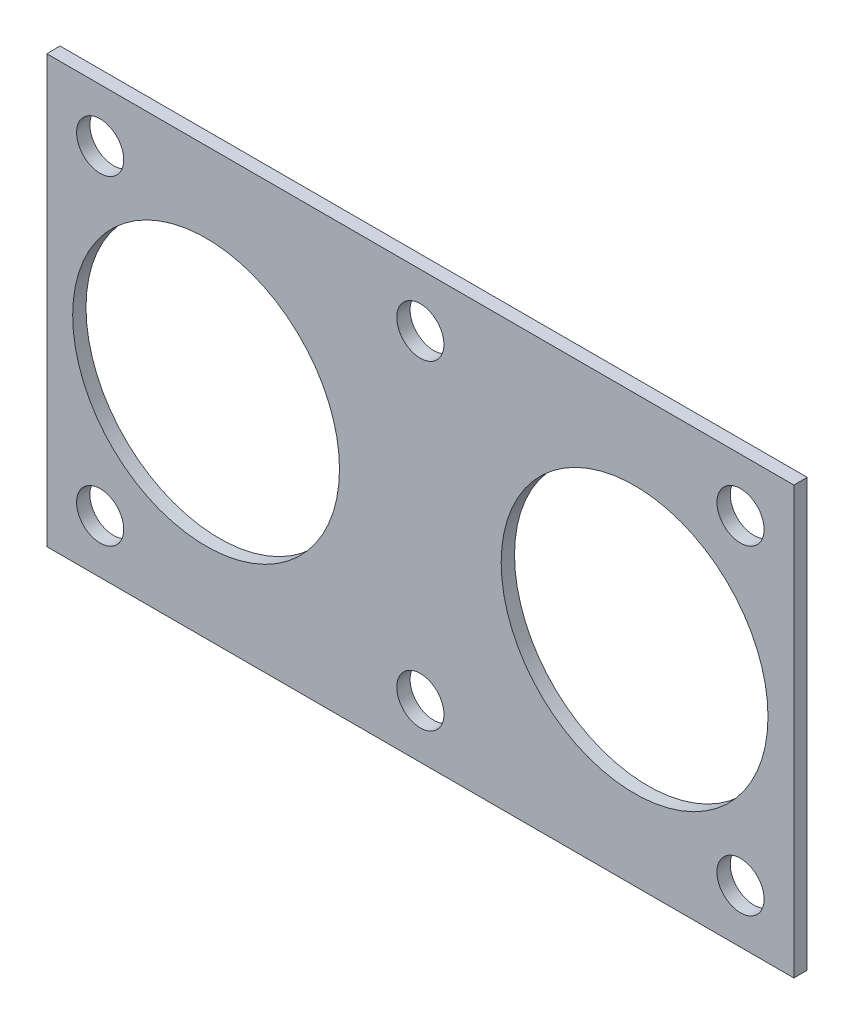
ISO-10303-21;
HEADER;
FILE_DESCRIPTION(('STEP AP214'),'2;1');
FILE_NAME('part.step','',(''),(''),'','','');
FILE_SCHEMA(('AUTOMOTIVE_DESIGN { 1 0 10303 214 1 1 1 1 }'));
ENDSEC;
DATA;
#1=APPLICATION_CONTEXT('core data for automotive mechanical design processes');
#2=APPLICATION_PROTOCOL_DEFINITION('international standard','automotive_design',2000,#1);
#3=PRODUCT_CONTEXT('',#1,'mechanical');
#4=PRODUCT('Part','Part','',(#3));
#5=PRODUCT_RELATED_PRODUCT_CATEGORY('part','',(#4));
#6=PRODUCT_DEFINITION_FORMATION('','',#4);
#7=PRODUCT_DEFINITION_CONTEXT('part definition',#1,'design');
#8=PRODUCT_DEFINITION('design','',#6,#7);
#9=PRODUCT_DEFINITION_SHAPE('','',#8);
#10=(LENGTH_UNIT() NAMED_UNIT(*) SI_UNIT(.MILLI.,.METRE.));
#11=(NAMED_UNIT(*) PLANE_ANGLE_UNIT() SI_UNIT($,.RADIAN.));
#12=(NAMED_UNIT(*) SI_UNIT($,.STERADIAN.) SOLID_ANGLE_UNIT());
#13=UNCERTAINTY_MEASURE_WITH_UNIT(LENGTH_MEASURE(1.E-05),#10,'distance_accuracy_value','');
#14=(GEOMETRIC_REPRESENTATION_CONTEXT(3) GLOBAL_UNCERTAINTY_ASSIGNED_CONTEXT((#13)) GLOBAL_UNIT_ASSIGNED_CONTEXT((#10,
#11,#12)) REPRESENTATION_CONTEXT('',''));
#15=CARTESIAN_POINT('',(0.,0.,0.));
#16=DIRECTION('',(0.,0.,1.));
#17=DIRECTION('',(1.,0.,0.));
#18=AXIS2_PLACEMENT_3D('',#15,#16,#17);
#19=CARTESIAN_POINT('',(0.,0.,103.978173403392));
#20=DIRECTION('',(0.,0.,-1.));
#21=DIRECTION('',(-1.,0.,0.));
#22=AXIS2_PLACEMENT_3D('',#19,#20,#21);
#23=CYLINDRICAL_SURFACE('',#22,15.875);
#24=CARTESIAN_POINT('',(0.,0.,0.));
#25=DIRECTION('',(0.,0.,1.));
#26=DIRECTION('',(1.,0.,0.));
#27=AXIS2_PLACEMENT_3D('',#24,#25,#26);
#28=CIRCLE('',#27,15.875);
#29=CARTESIAN_POINT('',(15.875,0.,0.));
#30=VERTEX_POINT('',#29);
#31=EDGE_CURVE('E103',#30,#30,#28,.T.);
#32=ORIENTED_EDGE('',*,*,#31,.F.);
#33=EDGE_LOOP('',(#32));
#34=FACE_BOUND('',#33,.T.);
#35=CARTESIAN_POINT('',(0.,0.,1.58749999999999));
#36=DIRECTION('',(0.,0.,1.));
#37=DIRECTION('',(1.,0.,0.));
#38=AXIS2_PLACEMENT_3D('',#35,#36,#37);
#39=CIRCLE('',#38,15.875);
#40=CARTESIAN_POINT('',(15.875,0.,1.58749999999999));
#41=VERTEX_POINT('',#40);
#42=EDGE_CURVE('E48',#41,#41,#39,.T.);
#43=ORIENTED_EDGE('',*,*,#42,.T.);
#44=EDGE_LOOP('',(#43));
#45=FACE_BOUND('',#44,.T.);
#46=ADVANCED_FACE('F39',(#34,#45),#23,.F.);
#47=CARTESIAN_POINT('',(-18.95475,25.4,103.978173403392));
#48=DIRECTION('',(0.,-1.,0.));
#49=DIRECTION('',(0.,0.,-1.));
#50=AXIS2_PLACEMENT_3D('',#47,#48,#49);
#51=PLANE('',#50);
#52=DIRECTION('',(-1.,0.,0.));
#53=VECTOR('',#52,1.);
#54=CARTESIAN_POINT('',(-18.95475,25.4,1.58749999999999));
#55=LINE('',#54,#53);
#56=CARTESIAN_POINT('',(69.94525,25.4,1.58749999999999));
#57=VERTEX_POINT('',#56);
#58=CARTESIAN_POINT('',(-18.9547500000005,25.4,1.58749999999999));
#59=VERTEX_POINT('',#58);
#60=EDGE_CURVE('E60',#57,#59,#55,.T.);
#61=ORIENTED_EDGE('',*,*,#60,.F.);
#62=DIRECTION('',(0.,0.,-1.));
#63=VECTOR('',#62,1.);
#64=CARTESIAN_POINT('',(69.94525,25.4,103.978173403392));
#65=LINE('',#64,#63);
#66=CARTESIAN_POINT('',(69.94525,25.4,0.));
#67=VERTEX_POINT('',#66);
#68=EDGE_CURVE('E114',#57,#67,#65,.T.);
#69=ORIENTED_EDGE('',*,*,#68,.T.);
#70=DIRECTION('',(-1.,0.,0.));
#71=VECTOR('',#70,1.);
#72=CARTESIAN_POINT('',(-18.95475,25.4,0.));
#73=LINE('',#72,#71);
#74=CARTESIAN_POINT('',(-18.95475,25.4,0.));
#75=VERTEX_POINT('',#74);
#76=EDGE_CURVE('E111',#67,#75,#73,.T.);
#77=ORIENTED_EDGE('',*,*,#76,.T.);
#78=DIRECTION('',(0.,0.,-1.));
#79=VECTOR('',#78,1.);
#80=CARTESIAN_POINT('',(-18.95475,25.4,103.978173403392));
#81=LINE('',#80,#79);
#82=EDGE_CURVE('E101',#59,#75,#81,.T.);
#83=ORIENTED_EDGE('',*,*,#82,.F.);
#84=EDGE_LOOP('',(#61,#69,#77,#83));
#85=FACE_BOUND('',#84,.T.);
#86=ADVANCED_FACE('F124',(#85),#51,.F.);
#87=CARTESIAN_POINT('',(69.94525,25.4,103.978173403392));
#88=DIRECTION('',(-1.,0.,0.));
#89=DIRECTION('',(0.,0.,1.));
#90=AXIS2_PLACEMENT_3D('',#87,#88,#89);
#91=PLANE('',#90);
#92=DIRECTION('',(0.,1.,0.));
#93=VECTOR('',#92,1.);
#94=CARTESIAN_POINT('',(69.94525,25.4,1.58749999999999));
#95=LINE('',#94,#93);
#96=CARTESIAN_POINT('',(69.9452499999995,-25.4,1.58749999999999));
#97=VERTEX_POINT('',#96);
#98=EDGE_CURVE('E88',#97,#57,#95,.T.);
#99=ORIENTED_EDGE('',*,*,#98,.F.);
#100=DIRECTION('',(0.,0.,-1.));
#101=VECTOR('',#100,1.);
#102=CARTESIAN_POINT('',(69.94525,-25.4,103.978173403392));
#103=LINE('',#102,#101);
#104=CARTESIAN_POINT('',(69.94525,-25.4,0.));
#105=VERTEX_POINT('',#104);
#106=EDGE_CURVE('E89',#97,#105,#103,.T.);
#107=ORIENTED_EDGE('',*,*,#106,.T.);
#108=DIRECTION('',(0.,1.,0.));
#109=VECTOR('',#108,1.);
#110=CARTESIAN_POINT('',(69.94525,25.4,0.));
#111=LINE('',#110,#109);
#112=EDGE_CURVE('E98',#105,#67,#111,.T.);
#113=ORIENTED_EDGE('',*,*,#112,.T.);
#114=ORIENTED_EDGE('',*,*,#68,.F.);
#115=EDGE_LOOP('',(#99,#107,#113,#114));
#116=FACE_BOUND('',#115,.T.);
#117=ADVANCED_FACE('F122',(#116),#91,.F.);
#118=CARTESIAN_POINT('',(-18.95475,-25.4,103.978173403392));
#119=DIRECTION('',(0.,1.,0.));
#120=DIRECTION('',(0.,0.,1.));
#121=AXIS2_PLACEMENT_3D('',#118,#119,#120);
#122=PLANE('',#121);
#123=DIRECTION('',(1.,0.,0.));
#124=VECTOR('',#123,1.);
#125=CARTESIAN_POINT('',(-18.95475,-25.4,1.58749999999999));
#126=LINE('',#125,#124);
#127=CARTESIAN_POINT('',(-18.9547500000005,-25.4,1.58749999999999));
#128=VERTEX_POINT('',#127);
#129=EDGE_CURVE('E85',#128,#97,#126,.T.);
#130=ORIENTED_EDGE('',*,*,#129,.F.);
#131=DIRECTION('',(0.,0.,-1.));
#132=VECTOR('',#131,1.);
#133=CARTESIAN_POINT('',(-18.95475,-25.4,103.978173403392));
#134=LINE('',#133,#132);
#135=CARTESIAN_POINT('',(-18.95475,-25.4,0.));
#136=VERTEX_POINT('',#135);
#137=EDGE_CURVE('E79',#128,#136,#134,.T.);
#138=ORIENTED_EDGE('',*,*,#137,.T.);
#139=DIRECTION('',(1.,0.,0.));
#140=VECTOR('',#139,1.);
#141=CARTESIAN_POINT('',(-18.95475,-25.4,0.));
#142=LINE('',#141,#140);
#143=EDGE_CURVE('E83',#136,#105,#142,.T.);
#144=ORIENTED_EDGE('',*,*,#143,.T.);
#145=ORIENTED_EDGE('',*,*,#106,.F.);
#146=EDGE_LOOP('',(#130,#138,#144,#145));
#147=FACE_BOUND('',#146,.T.);
#148=ADVANCED_FACE('F81',(#147),#122,.F.);
#149=CARTESIAN_POINT('',(-18.95475,25.4,103.978173403392));
#150=DIRECTION('',(1.,0.,0.));
#151=DIRECTION('',(0.,1.,0.));
#152=AXIS2_PLACEMENT_3D('',#149,#150,#151);
#153=PLANE('',#152);
#154=DIRECTION('',(0.,-1.,0.));
#155=VECTOR('',#154,1.);
#156=CARTESIAN_POINT('',(-18.95475,25.4,1.58749999999999));
#157=LINE('',#156,#155);
#158=EDGE_CURVE('E43',#59,#128,#157,.T.);
#159=ORIENTED_EDGE('',*,*,#158,.F.);
#160=ORIENTED_EDGE('',*,*,#82,.T.);
#161=DIRECTION('',(0.,-1.,0.));
#162=VECTOR('',#161,1.);
#163=CARTESIAN_POINT('',(-18.95475,25.4,0.));
#164=LINE('',#163,#162);
#165=EDGE_CURVE('E96',#75,#136,#164,.T.);
#166=ORIENTED_EDGE('',*,*,#165,.T.);
#167=ORIENTED_EDGE('',*,*,#137,.F.);
#168=EDGE_LOOP('',(#159,#160,#166,#167));
#169=FACE_BOUND('',#168,.T.);
#170=ADVANCED_FACE('F41',(#169),#153,.F.);
#171=CARTESIAN_POINT('',(0.,0.,0.));
#172=DIRECTION('',(0.,0.,1.));
#173=DIRECTION('',(1.,0.,0.));
#174=AXIS2_PLACEMENT_3D('',#171,#172,#173);
#175=PLANE('',#174);
#176=CARTESIAN_POINT('',(63.5952499999995,19.05,0.));
#177=DIRECTION('',(0.,0.,1.));
#178=DIRECTION('',(1.,0.,0.));
#179=AXIS2_PLACEMENT_3D('',#176,#177,#178);
#180=CIRCLE('',#179,2.80669999999998);
#181=CARTESIAN_POINT('',(66.4019499999995,19.05,0.));
#182=VERTEX_POINT('',#181);
#183=EDGE_CURVE('E153',#182,#182,#180,.T.);
#184=ORIENTED_EDGE('',*,*,#183,.T.);
#185=EDGE_LOOP('',(#184));
#186=FACE_BOUND('',#185,.T.);
#187=CARTESIAN_POINT('',(-12.6047500000005,19.05,0.));
#188=DIRECTION('',(0.,0.,1.));
#189=DIRECTION('',(1.,0.,0.));
#190=AXIS2_PLACEMENT_3D('',#187,#188,#189);
#191=CIRCLE('',#190,2.80669999999999);
#192=CARTESIAN_POINT('',(-9.79805000000051,19.05,0.));
#193=VERTEX_POINT('',#192);
#194=EDGE_CURVE('E157',#193,#193,#191,.T.);
#195=ORIENTED_EDGE('',*,*,#194,.T.);
#196=EDGE_LOOP('',(#195));
#197=FACE_BOUND('',#196,.T.);
#198=CARTESIAN_POINT('',(25.4952499999995,-19.05,0.));
#199=DIRECTION('',(0.,0.,1.));
#200=DIRECTION('',(1.,0.,0.));
#201=AXIS2_PLACEMENT_3D('',#198,#199,#200);
#202=CIRCLE('',#201,2.80669999999999);
#203=CARTESIAN_POINT('',(28.3019499999995,-19.05,0.));
#204=VERTEX_POINT('',#203);
#205=EDGE_CURVE('E161',#204,#204,#202,.T.);
#206=ORIENTED_EDGE('',*,*,#205,.T.);
#207=EDGE_LOOP('',(#206));
#208=FACE_BOUND('',#207,.T.);
#209=CARTESIAN_POINT('',(-12.6047500000005,-19.05,0.));
#210=DIRECTION('',(0.,0.,1.));
#211=DIRECTION('',(1.,0.,0.));
#212=AXIS2_PLACEMENT_3D('',#209,#210,#211);
#213=CIRCLE('',#212,2.80669999999999);
#214=CARTESIAN_POINT('',(-9.79805000000051,-19.05,0.));
#215=VERTEX_POINT('',#214);
#216=EDGE_CURVE('E165',#215,#215,#213,.T.);
#217=ORIENTED_EDGE('',*,*,#216,.T.);
#218=EDGE_LOOP('',(#217));
#219=FACE_BOUND('',#218,.T.);
#220=CARTESIAN_POINT('',(25.4952499999995,19.05,0.));
#221=DIRECTION('',(0.,0.,1.));
#222=DIRECTION('',(1.,0.,0.));
#223=AXIS2_PLACEMENT_3D('',#220,#221,#222);
#224=CIRCLE('',#223,2.80669999999999);
#225=CARTESIAN_POINT('',(28.3019499999995,19.05,0.));
#226=VERTEX_POINT('',#225);
#227=EDGE_CURVE('E169',#226,#226,#224,.T.);
#228=ORIENTED_EDGE('',*,*,#227,.T.);
#229=EDGE_LOOP('',(#228));
#230=FACE_BOUND('',#229,.T.);
#231=CARTESIAN_POINT('',(63.5952499999995,-19.05,0.));
#232=DIRECTION('',(0.,0.,1.));
#233=DIRECTION('',(1.,0.,0.));
#234=AXIS2_PLACEMENT_3D('',#231,#232,#233);
#235=CIRCLE('',#234,2.80669999999998);
#236=CARTESIAN_POINT('',(66.4019499999995,-19.05,0.));
#237=VERTEX_POINT('',#236);
#238=EDGE_CURVE('E172',#237,#237,#235,.T.);
#239=ORIENTED_EDGE('',*,*,#238,.T.);
#240=EDGE_LOOP('',(#239));
#241=FACE_BOUND('',#240,.T.);
#242=ORIENTED_EDGE('',*,*,#165,.F.);
#243=ORIENTED_EDGE('',*,*,#76,.F.);
#244=ORIENTED_EDGE('',*,*,#112,.F.);
#245=ORIENTED_EDGE('',*,*,#143,.F.);
#246=EDGE_LOOP('',(#242,#243,#244,#245));
#247=FACE_BOUND('',#246,.T.);
#248=ORIENTED_EDGE('',*,*,#31,.T.);
#249=EDGE_LOOP('',(#248));
#250=FACE_BOUND('',#249,.T.);
#251=CARTESIAN_POINT('',(50.9905000000005,0.,0.));
#252=DIRECTION('',(0.,0.,1.));
#253=DIRECTION('',(1.,0.,0.));
#254=AXIS2_PLACEMENT_3D('',#251,#252,#253);
#255=CIRCLE('',#254,15.875);
#256=CARTESIAN_POINT('',(66.8655000000005,0.,0.));
#257=VERTEX_POINT('',#256);
#258=EDGE_CURVE('E106',#257,#257,#255,.T.);
#259=ORIENTED_EDGE('',*,*,#258,.T.);
#260=EDGE_LOOP('',(#259));
#261=FACE_BOUND('',#260,.T.);
#262=ADVANCED_FACE('F93',(#186,#197,#208,#219,#230,#241,#247,#250,#261),#175,.F.);
#263=CARTESIAN_POINT('',(50.9905000000005,0.,103.978173403392));
#264=DIRECTION('',(0.,0.,-1.));
#265=DIRECTION('',(-1.,0.,0.));
#266=AXIS2_PLACEMENT_3D('',#263,#264,#265);
#267=CYLINDRICAL_SURFACE('',#266,15.875);
#268=ORIENTED_EDGE('',*,*,#258,.F.);
#269=EDGE_LOOP('',(#268));
#270=FACE_BOUND('',#269,.T.);
#271=CARTESIAN_POINT('',(50.9905000000005,0.,1.58749999999999));
#272=DIRECTION('',(0.,0.,1.));
#273=DIRECTION('',(1.,0.,0.));
#274=AXIS2_PLACEMENT_3D('',#271,#272,#273);
#275=CIRCLE('',#274,15.875);
#276=CARTESIAN_POINT('',(66.8655000000005,0.,1.58749999999999));
#277=VERTEX_POINT('',#276);
#278=EDGE_CURVE('E11',#277,#277,#275,.T.);
#279=ORIENTED_EDGE('',*,*,#278,.T.);
#280=EDGE_LOOP('',(#279));
#281=FACE_BOUND('',#280,.T.);
#282=ADVANCED_FACE('F143',(#270,#281),#267,.F.);
#283=CARTESIAN_POINT('',(0.,0.,1.58749999999999));
#284=DIRECTION('',(0.,0.,1.));
#285=DIRECTION('',(1.,0.,0.));
#286=AXIS2_PLACEMENT_3D('',#283,#284,#285);
#287=PLANE('',#286);
#288=CARTESIAN_POINT('',(63.5952499999995,19.05,1.58749999999999));
#289=DIRECTION('',(0.,0.,1.));
#290=DIRECTION('',(1.,0.,0.));
#291=AXIS2_PLACEMENT_3D('',#288,#289,#290);
#292=CIRCLE('',#291,2.8067);
#293=CARTESIAN_POINT('',(66.4019499999995,19.05,1.58749999999999));
#294=VERTEX_POINT('',#293);
#295=EDGE_CURVE('E221',#294,#294,#292,.T.);
#296=ORIENTED_EDGE('',*,*,#295,.F.);
#297=EDGE_LOOP('',(#296));
#298=FACE_BOUND('',#297,.T.);
#299=CARTESIAN_POINT('',(-12.6047500000005,19.05,1.58749999999999));
#300=DIRECTION('',(0.,0.,1.));
#301=DIRECTION('',(1.,0.,0.));
#302=AXIS2_PLACEMENT_3D('',#299,#300,#301);
#303=CIRCLE('',#302,2.80669999999999);
#304=CARTESIAN_POINT('',(-9.79805000000051,19.05,1.58749999999999));
#305=VERTEX_POINT('',#304);
#306=EDGE_CURVE('E223',#305,#305,#303,.T.);
#307=ORIENTED_EDGE('',*,*,#306,.F.);
#308=EDGE_LOOP('',(#307));
#309=FACE_BOUND('',#308,.T.);
#310=CARTESIAN_POINT('',(25.4952499999995,-19.05,1.58749999999999));
#311=DIRECTION('',(0.,0.,1.));
#312=DIRECTION('',(1.,0.,0.));
#313=AXIS2_PLACEMENT_3D('',#310,#311,#312);
#314=CIRCLE('',#313,2.80669999999999);
#315=CARTESIAN_POINT('',(28.3019499999995,-19.05,1.58749999999999));
#316=VERTEX_POINT('',#315);
#317=EDGE_CURVE('E229',#316,#316,#314,.T.);
#318=ORIENTED_EDGE('',*,*,#317,.F.);
#319=EDGE_LOOP('',(#318));
#320=FACE_BOUND('',#319,.T.);
#321=CARTESIAN_POINT('',(-12.6047500000005,-19.05,1.58749999999999));
#322=DIRECTION('',(0.,0.,1.));
#323=DIRECTION('',(1.,0.,0.));
#324=AXIS2_PLACEMENT_3D('',#321,#322,#323);
#325=CIRCLE('',#324,2.80669999999999);
#326=CARTESIAN_POINT('',(-9.79805000000051,-19.05,1.58749999999999));
#327=VERTEX_POINT('',#326);
#328=EDGE_CURVE('E233',#327,#327,#325,.T.);
#329=ORIENTED_EDGE('',*,*,#328,.F.);
#330=EDGE_LOOP('',(#329));
#331=FACE_BOUND('',#330,.T.);
#332=CARTESIAN_POINT('',(25.4952499999995,19.05,1.58749999999999));
#333=DIRECTION('',(0.,0.,1.));
#334=DIRECTION('',(1.,0.,0.));
#335=AXIS2_PLACEMENT_3D('',#332,#333,#334);
#336=CIRCLE('',#335,2.80669999999999);
#337=CARTESIAN_POINT('',(28.3019499999995,19.05,1.58749999999999));
#338=VERTEX_POINT('',#337);
#339=EDGE_CURVE('E237',#338,#338,#336,.T.);
#340=ORIENTED_EDGE('',*,*,#339,.F.);
#341=EDGE_LOOP('',(#340));
#342=FACE_BOUND('',#341,.T.);
#343=CARTESIAN_POINT('',(63.5952499999995,-19.05,1.58749999999999));
#344=DIRECTION('',(0.,0.,1.));
#345=DIRECTION('',(1.,0.,0.));
#346=AXIS2_PLACEMENT_3D('',#343,#344,#345);
#347=CIRCLE('',#346,2.8067);
#348=CARTESIAN_POINT('',(66.4019499999995,-19.05,1.58749999999999));
#349=VERTEX_POINT('',#348);
#350=EDGE_CURVE('E174',#349,#349,#347,.T.);
#351=ORIENTED_EDGE('',*,*,#350,.F.);
#352=EDGE_LOOP('',(#351));
#353=FACE_BOUND('',#352,.T.);
#354=ORIENTED_EDGE('',*,*,#42,.F.);
#355=EDGE_LOOP('',(#354));
#356=FACE_BOUND('',#355,.T.);
#357=ORIENTED_EDGE('',*,*,#278,.F.);
#358=EDGE_LOOP('',(#357));
#359=FACE_BOUND('',#358,.T.);
#360=ORIENTED_EDGE('',*,*,#158,.T.);
#361=ORIENTED_EDGE('',*,*,#129,.T.);
#362=ORIENTED_EDGE('',*,*,#98,.T.);
#363=ORIENTED_EDGE('',*,*,#60,.T.);
#364=EDGE_LOOP('',(#360,#361,#362,#363));
#365=FACE_BOUND('',#364,.T.);
#366=ADVANCED_FACE('F119',(#298,#309,#320,#331,#342,#353,#356,#359,#365),#287,.T.);
#367=CARTESIAN_POINT('',(63.5952499999995,-19.05,1.58749999999999));
#368=DIRECTION('',(0.,0.,1.));
#369=DIRECTION('',(1.,0.,0.));
#370=AXIS2_PLACEMENT_3D('',#367,#368,#369);
#371=CYLINDRICAL_SURFACE('',#370,2.80669999999999);
#372=ORIENTED_EDGE('',*,*,#238,.F.);
#373=EDGE_LOOP('',(#372));
#374=FACE_BOUND('',#373,.T.);
#375=ORIENTED_EDGE('',*,*,#350,.T.);
#376=EDGE_LOOP('',(#375));
#377=FACE_BOUND('',#376,.T.);
#378=ADVANCED_FACE('F186',(#374,#377),#371,.F.);
#379=CARTESIAN_POINT('',(25.4952499999995,19.05,1.58749999999999));
#380=DIRECTION('',(0.,0.,1.));
#381=DIRECTION('',(1.,0.,0.));
#382=AXIS2_PLACEMENT_3D('',#379,#380,#381);
#383=CYLINDRICAL_SURFACE('',#382,2.80669999999999);
#384=ORIENTED_EDGE('',*,*,#227,.F.);
#385=EDGE_LOOP('',(#384));
#386=FACE_BOUND('',#385,.T.);
#387=ORIENTED_EDGE('',*,*,#339,.T.);
#388=EDGE_LOOP('',(#387));
#389=FACE_BOUND('',#388,.T.);
#390=ADVANCED_FACE('F194',(#386,#389),#383,.F.);
#391=CARTESIAN_POINT('',(-12.6047500000005,-19.05,1.58749999999999));
#392=DIRECTION('',(0.,0.,1.));
#393=DIRECTION('',(1.,0.,0.));
#394=AXIS2_PLACEMENT_3D('',#391,#392,#393);
#395=CYLINDRICAL_SURFACE('',#394,2.80669999999999);
#396=ORIENTED_EDGE('',*,*,#216,.F.);
#397=EDGE_LOOP('',(#396));
#398=FACE_BOUND('',#397,.T.);
#399=ORIENTED_EDGE('',*,*,#328,.T.);
#400=EDGE_LOOP('',(#399));
#401=FACE_BOUND('',#400,.T.);
#402=ADVANCED_FACE('F201',(#398,#401),#395,.F.);
#403=CARTESIAN_POINT('',(25.4952499999995,-19.05,1.58749999999999));
#404=DIRECTION('',(0.,0.,1.));
#405=DIRECTION('',(1.,0.,0.));
#406=AXIS2_PLACEMENT_3D('',#403,#404,#405);
#407=CYLINDRICAL_SURFACE('',#406,2.80669999999999);
#408=ORIENTED_EDGE('',*,*,#205,.F.);
#409=EDGE_LOOP('',(#408));
#410=FACE_BOUND('',#409,.T.);
#411=ORIENTED_EDGE('',*,*,#317,.T.);
#412=EDGE_LOOP('',(#411));
#413=FACE_BOUND('',#412,.T.);
#414=ADVANCED_FACE('F205',(#410,#413),#407,.F.);
#415=CARTESIAN_POINT('',(-12.6047500000005,19.05,1.58749999999999));
#416=DIRECTION('',(0.,0.,1.));
#417=DIRECTION('',(1.,0.,0.));
#418=AXIS2_PLACEMENT_3D('',#415,#416,#417);
#419=CYLINDRICAL_SURFACE('',#418,2.80669999999999);
#420=ORIENTED_EDGE('',*,*,#194,.F.);
#421=EDGE_LOOP('',(#420));
#422=FACE_BOUND('',#421,.T.);
#423=ORIENTED_EDGE('',*,*,#306,.T.);
#424=EDGE_LOOP('',(#423));
#425=FACE_BOUND('',#424,.T.);
#426=ADVANCED_FACE('F209',(#422,#425),#419,.F.);
#427=CARTESIAN_POINT('',(63.5952499999995,19.05,1.58749999999999));
#428=DIRECTION('',(0.,0.,1.));
#429=DIRECTION('',(1.,0.,0.));
#430=AXIS2_PLACEMENT_3D('',#427,#428,#429);
#431=CYLINDRICAL_SURFACE('',#430,2.80669999999999);
#432=ORIENTED_EDGE('',*,*,#183,.F.);
#433=EDGE_LOOP('',(#432));
#434=FACE_BOUND('',#433,.T.);
#435=ORIENTED_EDGE('',*,*,#295,.T.);
#436=EDGE_LOOP('',(#435));
#437=FACE_BOUND('',#436,.T.);
#438=ADVANCED_FACE('F213',(#434,#437),#431,.F.);
#439=CLOSED_SHELL('',(#46,#86,#117,#148,#170,#262,#282,#366,#378,#390,#402,#414,#426,#438));
#440=MANIFOLD_SOLID_BREP('B2',#439);
#441=ADVANCED_BREP_SHAPE_REPRESENTATION('',(#18,#440),#14);
#442=SHAPE_DEFINITION_REPRESENTATION(#9,#441);
ENDSEC;
END-ISO-10303-21;
